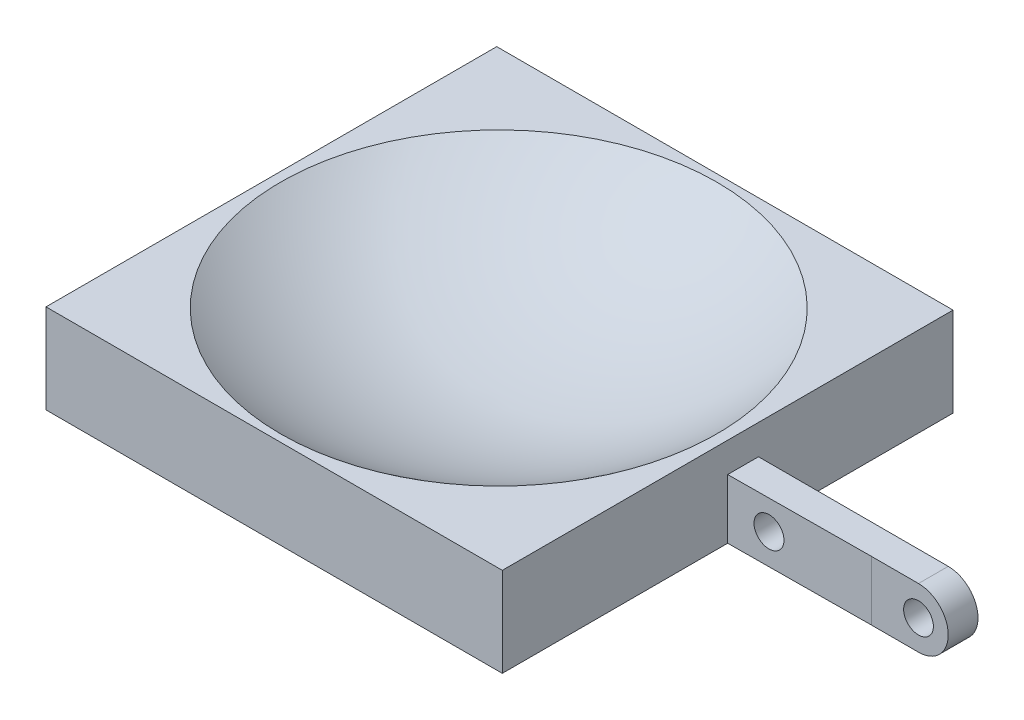
ISO-10303-21;
HEADER;
FILE_DESCRIPTION(('STEP AP214'),'2;1');
FILE_NAME('part.step','',(''),(''),'','','');
FILE_SCHEMA(('AUTOMOTIVE_DESIGN { 1 0 10303 214 1 1 1 1 }'));
ENDSEC;
DATA;
#1=APPLICATION_CONTEXT('core data for automotive mechanical design processes');
#2=APPLICATION_PROTOCOL_DEFINITION('international standard','automotive_design',2000,#1);
#3=PRODUCT_CONTEXT('',#1,'mechanical');
#4=PRODUCT('Part','Part','',(#3));
#5=PRODUCT_RELATED_PRODUCT_CATEGORY('part','',(#4));
#6=PRODUCT_DEFINITION_FORMATION('','',#4);
#7=PRODUCT_DEFINITION_CONTEXT('part definition',#1,'design');
#8=PRODUCT_DEFINITION('design','',#6,#7);
#9=PRODUCT_DEFINITION_SHAPE('','',#8);
#10=(LENGTH_UNIT() NAMED_UNIT(*) SI_UNIT(.MILLI.,.METRE.));
#11=(NAMED_UNIT(*) PLANE_ANGLE_UNIT() SI_UNIT($,.RADIAN.));
#12=(NAMED_UNIT(*) SI_UNIT($,.STERADIAN.) SOLID_ANGLE_UNIT());
#13=UNCERTAINTY_MEASURE_WITH_UNIT(LENGTH_MEASURE(1.E-05),#10,'distance_accuracy_value','');
#14=(GEOMETRIC_REPRESENTATION_CONTEXT(3) GLOBAL_UNCERTAINTY_ASSIGNED_CONTEXT((#13)) GLOBAL_UNIT_ASSIGNED_CONTEXT((#10,
#11,#12)) REPRESENTATION_CONTEXT('',''));
#15=CARTESIAN_POINT('',(0.,0.,0.));
#16=DIRECTION('',(0.,0.,1.));
#17=DIRECTION('',(1.,0.,0.));
#18=AXIS2_PLACEMENT_3D('',#15,#16,#17);
#19=CARTESIAN_POINT('',(-217.911131847254,17.3664833153662,10.));
#20=DIRECTION('',(0.,-1.,0.));
#21=DIRECTION('',(0.,0.,-1.));
#22=AXIS2_PLACEMENT_3D('',#19,#20,#21);
#23=PLANE('',#22);
#24=DIRECTION('',(-1.,0.,0.));
#25=VECTOR('',#24,1.);
#26=CARTESIAN_POINT('',(-217.911131847254,17.3664833153662,0.));
#27=LINE('',#26,#25);
#28=CARTESIAN_POINT('',(-57.9111318472541,17.3664833153662,0.));
#29=VERTEX_POINT('',#28);
#30=CARTESIAN_POINT('',(-121.698298742154,17.3664833153662,0.));
#31=VERTEX_POINT('',#30);
#32=EDGE_CURVE('E85',#29,#31,#27,.T.);
#33=ORIENTED_EDGE('',*,*,#32,.T.);
#34=DIRECTION('',(0.,0.,-1.));
#35=VECTOR('',#34,1.);
#36=CARTESIAN_POINT('',(-121.698298742154,17.3664833153662,-65.3949657529496));
#37=LINE('',#36,#35);
#38=CARTESIAN_POINT('',(-121.698298742154,17.3664833153662,10.3523307384709));
#39=VERTEX_POINT('',#38);
#40=EDGE_CURVE('E138',#39,#31,#37,.T.);
#41=ORIENTED_EDGE('',*,*,#40,.F.);
#42=DIRECTION('',(0.999973112537566,0.,-0.00733308952159962));
#43=VECTOR('',#42,1.);
#44=CARTESIAN_POINT('',(0.0693682980210013,17.3664833153662,9.45937352587547));
#45=LINE('',#44,#43);
#46=CARTESIAN_POINT('',(-73.6528924841695,17.3664833153662,10.));
#47=VERTEX_POINT('',#46);
#48=EDGE_CURVE('E111',#39,#47,#45,.T.);
#49=ORIENTED_EDGE('',*,*,#48,.T.);
#50=DIRECTION('',(-1.,0.,0.));
#51=VECTOR('',#50,1.);
#52=CARTESIAN_POINT('',(-217.911131847254,17.3664833153662,10.));
#53=LINE('',#52,#51);
#54=CARTESIAN_POINT('',(-57.9111318472541,17.3664833153662,10.));
#55=VERTEX_POINT('',#54);
#56=EDGE_CURVE('E94',#55,#47,#53,.T.);
#57=ORIENTED_EDGE('',*,*,#56,.F.);
#58=DIRECTION('',(0.,0.,-1.));
#59=VECTOR('',#58,1.);
#60=CARTESIAN_POINT('',(-57.9111318472541,17.3664833153662,10.));
#61=LINE('',#60,#59);
#62=EDGE_CURVE('E48',#55,#29,#61,.T.);
#63=ORIENTED_EDGE('',*,*,#62,.T.);
#64=EDGE_LOOP('',(#33,#41,#49,#57,#63));
#65=FACE_BOUND('',#64,.T.);
#66=ADVANCED_FACE('F39',(#65),#23,.F.);
#67=CARTESIAN_POINT('',(-217.911131847254,-2.63351668463377,10.));
#68=DIRECTION('',(0.,1.,0.));
#69=DIRECTION('',(0.,0.,1.));
#70=AXIS2_PLACEMENT_3D('',#67,#68,#69);
#71=PLANE('',#70);
#72=DIRECTION('',(0.,0.,1.));
#73=VECTOR('',#72,1.);
#74=CARTESIAN_POINT('',(-121.698298742154,-2.63351668463377,0.));
#75=LINE('',#74,#73);
#76=CARTESIAN_POINT('',(-121.698298742154,-2.63351668463377,-65.3949657529496));
#77=VERTEX_POINT('',#76);
#78=CARTESIAN_POINT('',(-121.698298742154,-2.63351668463377,0.));
#79=VERTEX_POINT('',#78);
#80=EDGE_CURVE('E176',#77,#79,#75,.T.);
#81=ORIENTED_EDGE('',*,*,#80,.T.);
#82=DIRECTION('',(1.,0.,0.));
#83=VECTOR('',#82,1.);
#84=CARTESIAN_POINT('',(-217.911131847254,-2.63351668463377,0.));
#85=LINE('',#84,#83);
#86=CARTESIAN_POINT('',(-57.9111318472541,-2.63351668463377,0.));
#87=VERTEX_POINT('',#86);
#88=EDGE_CURVE('E86',#79,#87,#85,.T.);
#89=ORIENTED_EDGE('',*,*,#88,.T.);
#90=DIRECTION('',(0.,0.,-1.));
#91=VECTOR('',#90,1.);
#92=CARTESIAN_POINT('',(-57.9111318472541,-2.63351668463377,10.));
#93=LINE('',#92,#91);
#94=CARTESIAN_POINT('',(-57.9111318472541,-2.63351668463377,10.));
#95=VERTEX_POINT('',#94);
#96=EDGE_CURVE('E11',#95,#87,#93,.T.);
#97=ORIENTED_EDGE('',*,*,#96,.F.);
#98=DIRECTION('',(1.,0.,0.));
#99=VECTOR('',#98,1.);
#100=CARTESIAN_POINT('',(-217.911131847254,-2.63351668463377,10.));
#101=LINE('',#100,#99);
#102=CARTESIAN_POINT('',(-73.6528924841695,-2.63351668463377,10.));
#103=VERTEX_POINT('',#102);
#104=EDGE_CURVE('E100',#103,#95,#101,.T.);
#105=ORIENTED_EDGE('',*,*,#104,.F.);
#106=DIRECTION('',(0.999973112537566,0.,-0.00733308952159962));
#107=VECTOR('',#106,1.);
#108=CARTESIAN_POINT('',(0.0693682980210013,-2.63351668463377,9.45937352587547));
#109=LINE('',#108,#107);
#110=CARTESIAN_POINT('',(-121.698298742154,-2.63351668463377,10.3523307384709));
#111=VERTEX_POINT('',#110);
#112=EDGE_CURVE('E114',#111,#103,#109,.T.);
#113=ORIENTED_EDGE('',*,*,#112,.F.);
#114=CARTESIAN_POINT('',(-121.698298742154,-2.63351668463377,86.0996272298914));
#115=VERTEX_POINT('',#114);
#116=EDGE_CURVE('E190',#111,#115,#75,.T.);
#117=ORIENTED_EDGE('',*,*,#116,.T.);
#118=DIRECTION('',(-1.,0.,0.));
#119=VECTOR('',#118,1.);
#120=CARTESIAN_POINT('',(0.,-2.63351668463377,86.0996272298914));
#121=LINE('',#120,#119);
#122=CARTESIAN_POINT('',(-275.069815885844,-2.63351668463377,86.0996272298914));
#123=VERTEX_POINT('',#122);
#124=EDGE_CURVE('E187',#115,#123,#121,.T.);
#125=ORIENTED_EDGE('',*,*,#124,.T.);
#126=DIRECTION('',(0.,0.,-1.));
#127=VECTOR('',#126,1.);
#128=CARTESIAN_POINT('',(-275.069815885844,-2.63351668463377,0.));
#129=LINE('',#128,#127);
#130=CARTESIAN_POINT('',(-275.069815885844,-2.63351668463377,-65.3949657529496));
#131=VERTEX_POINT('',#130);
#132=EDGE_CURVE('E184',#123,#131,#129,.T.);
#133=ORIENTED_EDGE('',*,*,#132,.T.);
#134=DIRECTION('',(1.,0.,0.));
#135=VECTOR('',#134,1.);
#136=CARTESIAN_POINT('',(0.,-2.63351668463377,-65.3949657529496));
#137=LINE('',#136,#135);
#138=EDGE_CURVE('E182',#131,#77,#137,.T.);
#139=ORIENTED_EDGE('',*,*,#138,.T.);
#140=EDGE_LOOP('',(#81,#89,#97,#105,#113,#117,#125,#133,#139));
#141=FACE_BOUND('',#140,.T.);
#142=ADVANCED_FACE('F41',(#141),#71,.F.);
#143=CARTESIAN_POINT('',(-57.9111318472541,7.36648331536624,10.));
#144=DIRECTION('',(0.,0.,-1.));
#145=DIRECTION('',(-1.,0.,0.));
#146=AXIS2_PLACEMENT_3D('',#143,#144,#145);
#147=PLANE('',#146);
#148=CARTESIAN_POINT('',(-57.9111318472541,7.36648331536624,10.));
#149=DIRECTION('',(0.,0.,1.));
#150=DIRECTION('',(1.,0.,0.));
#151=AXIS2_PLACEMENT_3D('',#148,#149,#150);
#152=CIRCLE('',#151,4.99999999999999);
#153=CARTESIAN_POINT('',(-52.9111318472542,7.36648331536624,10.));
#154=VERTEX_POINT('',#153);
#155=EDGE_CURVE('E163',#154,#154,#152,.T.);
#156=ORIENTED_EDGE('',*,*,#155,.F.);
#157=EDGE_LOOP('',(#156));
#158=FACE_BOUND('',#157,.T.);
#159=DIRECTION('',(0.,1.,0.));
#160=VECTOR('',#159,1.);
#161=CARTESIAN_POINT('',(-73.6528924841695,7.36648331536624,10.));
#162=LINE('',#161,#160);
#163=EDGE_CURVE('E107',#103,#47,#162,.T.);
#164=ORIENTED_EDGE('',*,*,#163,.F.);
#165=ORIENTED_EDGE('',*,*,#104,.T.);
#166=CARTESIAN_POINT('',(-57.9111318472541,7.36648331536624,10.));
#167=DIRECTION('',(0.,0.,1.));
#168=DIRECTION('',(-1.,0.,0.));
#169=AXIS2_PLACEMENT_3D('',#166,#167,#168);
#170=CIRCLE('',#169,10.);
#171=EDGE_CURVE('E65',#95,#55,#170,.T.);
#172=ORIENTED_EDGE('',*,*,#171,.T.);
#173=ORIENTED_EDGE('',*,*,#56,.T.);
#174=EDGE_LOOP('',(#164,#165,#172,#173));
#175=FACE_BOUND('',#174,.T.);
#176=ADVANCED_FACE('F196',(#158,#175),#147,.F.);
#177=CARTESIAN_POINT('',(-57.9111318472541,7.36648331536624,0.));
#178=DIRECTION('',(0.,0.,-1.));
#179=DIRECTION('',(-1.,0.,0.));
#180=AXIS2_PLACEMENT_3D('',#177,#178,#179);
#181=PLANE('',#180);
#182=CARTESIAN_POINT('',(-107.910779489922,7.55419482024334,0.));
#183=DIRECTION('',(0.,0.,-1.));
#184=DIRECTION('',(-1.,0.,0.));
#185=AXIS2_PLACEMENT_3D('',#182,#183,#184);
#186=CIRCLE('',#185,5.);
#187=CARTESIAN_POINT('',(-112.910779489922,7.55419482024334,0.));
#188=VERTEX_POINT('',#187);
#189=EDGE_CURVE('E109',#188,#188,#186,.T.);
#190=ORIENTED_EDGE('',*,*,#189,.F.);
#191=EDGE_LOOP('',(#190));
#192=FACE_BOUND('',#191,.T.);
#193=CARTESIAN_POINT('',(-57.9111318472541,7.36648331536624,0.));
#194=DIRECTION('',(0.,0.,1.));
#195=DIRECTION('',(1.,0.,0.));
#196=AXIS2_PLACEMENT_3D('',#193,#194,#195);
#197=CIRCLE('',#196,4.99999999999999);
#198=CARTESIAN_POINT('',(-52.9111318472542,7.36648331536624,0.));
#199=VERTEX_POINT('',#198);
#200=EDGE_CURVE('E164',#199,#199,#197,.T.);
#201=ORIENTED_EDGE('',*,*,#200,.T.);
#202=EDGE_LOOP('',(#201));
#203=FACE_BOUND('',#202,.T.);
#204=ORIENTED_EDGE('',*,*,#88,.F.);
#205=DIRECTION('',(0.,1.,0.));
#206=VECTOR('',#205,1.);
#207=CARTESIAN_POINT('',(-121.698298742154,-2.63351668463377,0.));
#208=LINE('',#207,#206);
#209=EDGE_CURVE('E98',#79,#31,#208,.T.);
#210=ORIENTED_EDGE('',*,*,#209,.T.);
#211=ORIENTED_EDGE('',*,*,#32,.F.);
#212=CARTESIAN_POINT('',(-57.9111318472541,7.36648331536624,0.));
#213=DIRECTION('',(0.,0.,1.));
#214=DIRECTION('',(-1.,0.,0.));
#215=AXIS2_PLACEMENT_3D('',#212,#213,#214);
#216=CIRCLE('',#215,10.);
#217=EDGE_CURVE('E77',#87,#29,#216,.T.);
#218=ORIENTED_EDGE('',*,*,#217,.F.);
#219=EDGE_LOOP('',(#204,#210,#211,#218));
#220=FACE_BOUND('',#219,.T.);
#221=ADVANCED_FACE('F96',(#192,#203,#220),#181,.T.);
#222=CARTESIAN_POINT('',(-57.9111318472541,7.36648331536624,10.));
#223=DIRECTION('',(0.,0.,-1.));
#224=DIRECTION('',(-1.,0.,0.));
#225=AXIS2_PLACEMENT_3D('',#222,#223,#224);
#226=CYLINDRICAL_SURFACE('',#225,10.);
#227=ORIENTED_EDGE('',*,*,#217,.T.);
#228=ORIENTED_EDGE('',*,*,#62,.F.);
#229=ORIENTED_EDGE('',*,*,#171,.F.);
#230=ORIENTED_EDGE('',*,*,#96,.T.);
#231=EDGE_LOOP('',(#227,#228,#229,#230));
#232=FACE_BOUND('',#231,.T.);
#233=ADVANCED_FACE('F79',(#232),#226,.T.);
#234=CARTESIAN_POINT('',(-57.9111318472541,7.36648331536624,0.));
#235=DIRECTION('',(0.,0.,1.));
#236=DIRECTION('',(1.,0.,0.));
#237=AXIS2_PLACEMENT_3D('',#234,#235,#236);
#238=CYLINDRICAL_SURFACE('',#237,4.99999999999999);
#239=ORIENTED_EDGE('',*,*,#200,.F.);
#240=EDGE_LOOP('',(#239));
#241=FACE_BOUND('',#240,.T.);
#242=ORIENTED_EDGE('',*,*,#155,.T.);
#243=EDGE_LOOP('',(#242));
#244=FACE_BOUND('',#243,.T.);
#245=ADVANCED_FACE('F233',(#241,#244),#238,.F.);
#246=CARTESIAN_POINT('',(-275.069815885844,17.3664833153662,-65.3949657529496));
#247=DIRECTION('',(-1.,0.,0.));
#248=DIRECTION('',(0.,0.,1.));
#249=AXIS2_PLACEMENT_3D('',#246,#247,#248);
#250=PLANE('',#249);
#251=DIRECTION('',(0.,0.,1.));
#252=VECTOR('',#251,1.);
#253=CARTESIAN_POINT('',(-275.069815885844,27.3664833153662,-65.3949657529496));
#254=LINE('',#253,#252);
#255=CARTESIAN_POINT('',(-275.069815885844,27.3664833153662,-65.3949657529496));
#256=VERTEX_POINT('',#255);
#257=CARTESIAN_POINT('',(-275.069815885844,27.3664833153662,86.0996272298914));
#258=VERTEX_POINT('',#257);
#259=EDGE_CURVE('E150',#256,#258,#254,.T.);
#260=ORIENTED_EDGE('',*,*,#259,.F.);
#261=DIRECTION('',(0.,1.,0.));
#262=VECTOR('',#261,1.);
#263=CARTESIAN_POINT('',(-275.069815885844,17.3664833153662,-65.3949657529496));
#264=LINE('',#263,#262);
#265=EDGE_CURVE('E108',#131,#256,#264,.T.);
#266=ORIENTED_EDGE('',*,*,#265,.F.);
#267=ORIENTED_EDGE('',*,*,#132,.F.);
#268=DIRECTION('',(0.,1.,0.));
#269=VECTOR('',#268,1.);
#270=CARTESIAN_POINT('',(-275.069815885844,17.3664833153662,86.0996272298914));
#271=LINE('',#270,#269);
#272=EDGE_CURVE('E139',#123,#258,#271,.T.);
#273=ORIENTED_EDGE('',*,*,#272,.T.);
#274=EDGE_LOOP('',(#260,#266,#267,#273));
#275=FACE_BOUND('',#274,.T.);
#276=ADVANCED_FACE('F208',(#275),#250,.T.);
#277=CARTESIAN_POINT('',(-275.069815885844,17.3664833153662,-65.3949657529496));
#278=DIRECTION('',(0.,0.,-1.));
#279=DIRECTION('',(-1.,0.,0.));
#280=AXIS2_PLACEMENT_3D('',#277,#278,#279);
#281=PLANE('',#280);
#282=DIRECTION('',(-1.,0.,0.));
#283=VECTOR('',#282,1.);
#284=CARTESIAN_POINT('',(-275.069815885844,27.3664833153662,-65.3949657529496));
#285=LINE('',#284,#283);
#286=CARTESIAN_POINT('',(-121.698298742154,27.3664833153662,-65.3949657529496));
#287=VERTEX_POINT('',#286);
#288=EDGE_CURVE('E140',#287,#256,#285,.T.);
#289=ORIENTED_EDGE('',*,*,#288,.F.);
#290=DIRECTION('',(0.,1.,0.));
#291=VECTOR('',#290,1.);
#292=CARTESIAN_POINT('',(-121.698298742154,17.3664833153662,-65.3949657529496));
#293=LINE('',#292,#291);
#294=EDGE_CURVE('E159',#77,#287,#293,.T.);
#295=ORIENTED_EDGE('',*,*,#294,.F.);
#296=ORIENTED_EDGE('',*,*,#138,.F.);
#297=ORIENTED_EDGE('',*,*,#265,.T.);
#298=EDGE_LOOP('',(#289,#295,#296,#297));
#299=FACE_BOUND('',#298,.T.);
#300=ADVANCED_FACE('F218',(#299),#281,.T.);
#301=CARTESIAN_POINT('',(-121.698298742154,17.3664833153662,-65.3949657529496));
#302=DIRECTION('',(1.,0.,0.));
#303=DIRECTION('',(0.,0.,-1.));
#304=AXIS2_PLACEMENT_3D('',#301,#302,#303);
#305=PLANE('',#304);
#306=DIRECTION('',(0.,0.,-1.));
#307=VECTOR('',#306,1.);
#308=CARTESIAN_POINT('',(-121.698298742154,27.3664833153662,-65.3949657529496));
#309=LINE('',#308,#307);
#310=CARTESIAN_POINT('',(-121.698298742154,27.3664833153662,86.0996272298914));
#311=VERTEX_POINT('',#310);
#312=EDGE_CURVE('E56',#311,#287,#309,.T.);
#313=ORIENTED_EDGE('',*,*,#312,.F.);
#314=DIRECTION('',(0.,1.,0.));
#315=VECTOR('',#314,1.);
#316=CARTESIAN_POINT('',(-121.698298742154,17.3664833153662,86.0996272298914));
#317=LINE('',#316,#315);
#318=EDGE_CURVE('E143',#115,#311,#317,.T.);
#319=ORIENTED_EDGE('',*,*,#318,.F.);
#320=ORIENTED_EDGE('',*,*,#116,.F.);
#321=DIRECTION('',(0.,1.,0.));
#322=VECTOR('',#321,1.);
#323=CARTESIAN_POINT('',(-121.698298742154,-2.63351668463377,10.3523307384709));
#324=LINE('',#323,#322);
#325=EDGE_CURVE('E133',#111,#39,#324,.T.);
#326=ORIENTED_EDGE('',*,*,#325,.T.);
#327=ORIENTED_EDGE('',*,*,#40,.T.);
#328=ORIENTED_EDGE('',*,*,#209,.F.);
#329=ORIENTED_EDGE('',*,*,#80,.F.);
#330=ORIENTED_EDGE('',*,*,#294,.T.);
#331=EDGE_LOOP('',(#313,#319,#320,#326,#327,#328,#329,#330));
#332=FACE_BOUND('',#331,.T.);
#333=ADVANCED_FACE('F180',(#332),#305,.T.);
#334=CARTESIAN_POINT('',(-275.069815885844,17.3664833153662,86.0996272298914));
#335=DIRECTION('',(0.,0.,1.));
#336=DIRECTION('',(1.,0.,0.));
#337=AXIS2_PLACEMENT_3D('',#334,#335,#336);
#338=PLANE('',#337);
#339=DIRECTION('',(1.,0.,0.));
#340=VECTOR('',#339,1.);
#341=CARTESIAN_POINT('',(-275.069815885844,27.3664833153662,86.0996272298914));
#342=LINE('',#341,#340);
#343=EDGE_CURVE('E153',#258,#311,#342,.T.);
#344=ORIENTED_EDGE('',*,*,#343,.F.);
#345=ORIENTED_EDGE('',*,*,#272,.F.);
#346=ORIENTED_EDGE('',*,*,#124,.F.);
#347=ORIENTED_EDGE('',*,*,#318,.T.);
#348=EDGE_LOOP('',(#344,#345,#346,#347));
#349=FACE_BOUND('',#348,.T.);
#350=ADVANCED_FACE('F213',(#349),#338,.T.);
#351=CARTESIAN_POINT('',(-198.65289248417,122.366483315366,10.352330738471));
#352=DIRECTION('',(-0.707106781186548,0.,-0.707106781186547));
#353=DIRECTION('',(-0.707106781186547,0.,0.707106781186548));
#354=AXIS2_PLACEMENT_3D('',#351,#352,#353);
#355=SPHERICAL_SURFACE('',#354,120.);
#356=CARTESIAN_POINT('',(-198.65289248417,122.366483315366,10.352330738471));
#357=DIRECTION('',(0.,1.,0.));
#358=DIRECTION('',(0.,0.,1.));
#359=AXIS2_PLACEMENT_3D('',#356,#357,#358);
#360=SPHERICAL_SURFACE('',#359,120.);
#361=CARTESIAN_POINT('',(-198.65289248417,27.3664833153662,10.352330738471));
#362=DIRECTION('',(0.,1.,0.));
#363=DIRECTION('',(0.,0.,1.));
#364=AXIS2_PLACEMENT_3D('',#361,#362,#363);
#365=CIRCLE('',#364,73.3143914930759);
#366=CARTESIAN_POINT('',(-198.65289248417,27.3664833153662,83.6667222315469));
#367=VERTEX_POINT('',#366);
#368=EDGE_CURVE('E105',#367,#367,#365,.F.);
#369=ORIENTED_EDGE('',*,*,#368,.F.);
#370=EDGE_LOOP('',(#369));
#371=FACE_BOUND('',#370,.T.);
#372=ADVANCED_FACE('F263',(#371),#360,.F.);
#373=CARTESIAN_POINT('',(0.,27.3664833153662,0.));
#374=DIRECTION('',(0.,1.,0.));
#375=DIRECTION('',(0.,0.,1.));
#376=AXIS2_PLACEMENT_3D('',#373,#374,#375);
#377=PLANE('',#376);
#378=ORIENTED_EDGE('',*,*,#368,.T.);
#379=EDGE_LOOP('',(#378));
#380=FACE_BOUND('',#379,.T.);
#381=ORIENTED_EDGE('',*,*,#288,.T.);
#382=ORIENTED_EDGE('',*,*,#259,.T.);
#383=ORIENTED_EDGE('',*,*,#343,.T.);
#384=ORIENTED_EDGE('',*,*,#312,.T.);
#385=EDGE_LOOP('',(#381,#382,#383,#384));
#386=FACE_BOUND('',#385,.T.);
#387=ADVANCED_FACE('F124',(#380,#386),#377,.T.);
#388=CARTESIAN_POINT('',(0.0693682980210013,-2.63351668463377,9.45937352587547));
#389=DIRECTION('',(0.00733308952159962,0.,0.999973112537566));
#390=DIRECTION('',(0.999973112537566,0.,-0.00733308952159962));
#391=AXIS2_PLACEMENT_3D('',#388,#389,#390);
#392=PLANE('',#391);
#393=CARTESIAN_POINT('',(-107.910779489922,7.55419482024334,10.2512229069805));
#394=DIRECTION('',(0.00733308952159962,0.,0.999973112537566));
#395=DIRECTION('',(0.999973112537566,0.,-0.00733308952159962));
#396=AXIS2_PLACEMENT_3D('',#393,#394,#395);
#397=ELLIPSE('',#396,5.00013444092695,5.);
#398=CARTESIAN_POINT('',(-102.910779489922,7.55419482024334,10.2145564735051));
#399=VERTEX_POINT('',#398);
#400=EDGE_CURVE('E43',#399,#399,#397,.T.);
#401=ORIENTED_EDGE('',*,*,#400,.F.);
#402=EDGE_LOOP('',(#401));
#403=FACE_BOUND('',#402,.T.);
#404=ORIENTED_EDGE('',*,*,#48,.F.);
#405=ORIENTED_EDGE('',*,*,#325,.F.);
#406=ORIENTED_EDGE('',*,*,#112,.T.);
#407=ORIENTED_EDGE('',*,*,#163,.T.);
#408=EDGE_LOOP('',(#404,#405,#406,#407));
#409=FACE_BOUND('',#408,.T.);
#410=ADVANCED_FACE('F121',(#403,#409),#392,.T.);
#411=CARTESIAN_POINT('',(-107.910779489922,7.55419482024334,-65.3949657529496));
#412=DIRECTION('',(0.,0.,1.));
#413=DIRECTION('',(1.,0.,0.));
#414=AXIS2_PLACEMENT_3D('',#411,#412,#413);
#415=CYLINDRICAL_SURFACE('',#414,5.);
#416=ORIENTED_EDGE('',*,*,#189,.T.);
#417=EDGE_LOOP('',(#416));
#418=FACE_BOUND('',#417,.T.);
#419=ORIENTED_EDGE('',*,*,#400,.T.);
#420=EDGE_LOOP('',(#419));
#421=FACE_BOUND('',#420,.T.);
#422=ADVANCED_FACE('F119',(#418,#421),#415,.F.);
#423=CLOSED_SHELL('',(#66,#142,#176,#221,#233,#245,#276,#300,#333,#350,#372,#387,#410,#422));
#424=MANIFOLD_SOLID_BREP('B2',#423);
#425=ADVANCED_BREP_SHAPE_REPRESENTATION('',(#18,#424),#14);
#426=SHAPE_DEFINITION_REPRESENTATION(#9,#425);
ENDSEC;
END-ISO-10303-21;
